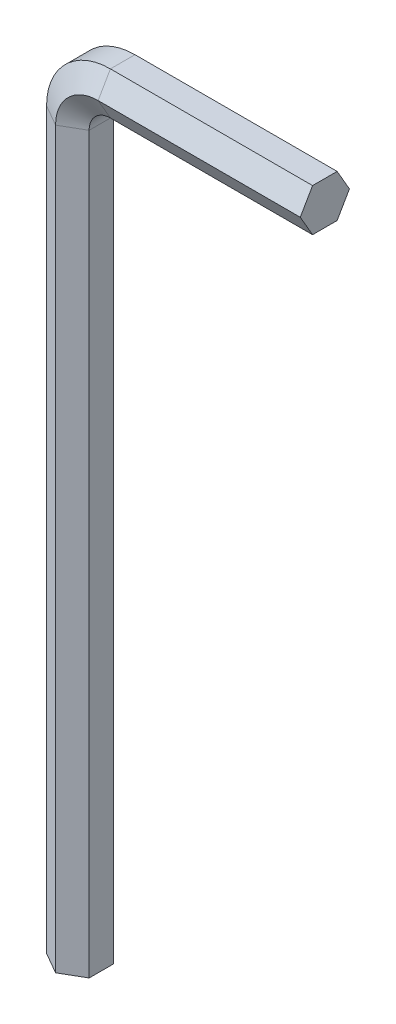
ISO-10303-21;
HEADER;
FILE_DESCRIPTION(('STEP AP214'),'2;1');
FILE_NAME('part.step','',(''),(''),'','','');
FILE_SCHEMA(('AUTOMOTIVE_DESIGN { 1 0 10303 214 1 1 1 1 }'));
ENDSEC;
DATA;
#1=APPLICATION_CONTEXT('core data for automotive mechanical design processes');
#2=APPLICATION_PROTOCOL_DEFINITION('international standard','automotive_design',2000,#1);
#3=PRODUCT_CONTEXT('',#1,'mechanical');
#4=PRODUCT('Part','Part','',(#3));
#5=PRODUCT_RELATED_PRODUCT_CATEGORY('part','',(#4));
#6=PRODUCT_DEFINITION_FORMATION('','',#4);
#7=PRODUCT_DEFINITION_CONTEXT('part definition',#1,'design');
#8=PRODUCT_DEFINITION('design','',#6,#7);
#9=PRODUCT_DEFINITION_SHAPE('','',#8);
#10=(LENGTH_UNIT() NAMED_UNIT(*) SI_UNIT(.MILLI.,.METRE.));
#11=(NAMED_UNIT(*) PLANE_ANGLE_UNIT() SI_UNIT($,.RADIAN.));
#12=(NAMED_UNIT(*) SI_UNIT($,.STERADIAN.) SOLID_ANGLE_UNIT());
#13=UNCERTAINTY_MEASURE_WITH_UNIT(LENGTH_MEASURE(1.E-05),#10,'distance_accuracy_value','');
#14=(GEOMETRIC_REPRESENTATION_CONTEXT(3) GLOBAL_UNCERTAINTY_ASSIGNED_CONTEXT((#13)) GLOBAL_UNIT_ASSIGNED_CONTEXT((#10,
#11,#12)) REPRESENTATION_CONTEXT('',''));
#15=CARTESIAN_POINT('',(0.,0.,0.));
#16=DIRECTION('',(0.,0.,1.));
#17=DIRECTION('',(1.,0.,0.));
#18=AXIS2_PLACEMENT_3D('',#15,#16,#17);
#19=CARTESIAN_POINT('',(0.,0.,0.));
#20=DIRECTION('',(0.,1.,0.));
#21=DIRECTION('',(0.,0.,1.));
#22=AXIS2_PLACEMENT_3D('',#19,#20,#21);
#23=PLANE('',#22);
#24=DIRECTION('',(0.866025403784438,0.,-0.500000000000001));
#25=VECTOR('',#24,1.);
#26=CARTESIAN_POINT('',(2.,0.,2.30940107675851));
#27=LINE('',#26,#25);
#28=CARTESIAN_POINT('',(2.,0.,2.30940107675851));
#29=VERTEX_POINT('',#28);
#30=CARTESIAN_POINT('',(4.,0.,1.15470053837925));
#31=VERTEX_POINT('',#30);
#32=EDGE_CURVE('E183',#29,#31,#27,.T.);
#33=ORIENTED_EDGE('',*,*,#32,.F.);
#34=DIRECTION('',(0.866025403784439,0.,0.5));
#35=VECTOR('',#34,1.);
#36=CARTESIAN_POINT('',(0.,0.,1.15470053837926));
#37=LINE('',#36,#35);
#38=CARTESIAN_POINT('',(0.,0.,1.15470053837926));
#39=VERTEX_POINT('',#38);
#40=EDGE_CURVE('E225',#39,#29,#37,.T.);
#41=ORIENTED_EDGE('',*,*,#40,.F.);
#42=DIRECTION('',(0.,0.,1.));
#43=VECTOR('',#42,1.);
#44=CARTESIAN_POINT('',(0.,0.,-1.15470053837926));
#45=LINE('',#44,#43);
#46=CARTESIAN_POINT('',(0.,0.,-1.15470053837926));
#47=VERTEX_POINT('',#46);
#48=EDGE_CURVE('E212',#47,#39,#45,.T.);
#49=ORIENTED_EDGE('',*,*,#48,.F.);
#50=DIRECTION('',(-0.866025403784438,0.,0.5));
#51=VECTOR('',#50,1.);
#52=CARTESIAN_POINT('',(2.,0.,-2.30940107675851));
#53=LINE('',#52,#51);
#54=CARTESIAN_POINT('',(2.,0.,-2.30940107675851));
#55=VERTEX_POINT('',#54);
#56=EDGE_CURVE('E135',#55,#47,#53,.T.);
#57=ORIENTED_EDGE('',*,*,#56,.F.);
#58=DIRECTION('',(-0.866025403784437,0.,-0.500000000000003));
#59=VECTOR('',#58,1.);
#60=CARTESIAN_POINT('',(4.,0.,-1.15470053837925));
#61=LINE('',#60,#59);
#62=CARTESIAN_POINT('',(4.,0.,-1.15470053837925));
#63=VERTEX_POINT('',#62);
#64=EDGE_CURVE('E139',#63,#55,#61,.T.);
#65=ORIENTED_EDGE('',*,*,#64,.F.);
#66=DIRECTION('',(0.,0.,-1.));
#67=VECTOR('',#66,1.);
#68=CARTESIAN_POINT('',(4.,0.,1.15470053837925));
#69=LINE('',#68,#67);
#70=EDGE_CURVE('E144',#31,#63,#69,.T.);
#71=ORIENTED_EDGE('',*,*,#70,.F.);
#72=EDGE_LOOP('',(#33,#41,#49,#57,#65,#71));
#73=FACE_BOUND('',#72,.T.);
#74=ADVANCED_FACE('F34',(#73),#23,.F.);
#75=CARTESIAN_POINT('',(25.,75.,0.));
#76=DIRECTION('',(1.,0.,0.));
#77=DIRECTION('',(0.,0.,1.));
#78=AXIS2_PLACEMENT_3D('',#75,#76,#77);
#79=PLANE('',#78);
#80=DIRECTION('',(0.,-0.866025403784438,-0.500000000000001));
#81=VECTOR('',#80,1.);
#82=CARTESIAN_POINT('',(25.,73.,2.30940107675851));
#83=LINE('',#82,#81);
#84=CARTESIAN_POINT('',(25.,73.,2.30940107675851));
#85=VERTEX_POINT('',#84);
#86=CARTESIAN_POINT('',(25.,71.,1.15470053837925));
#87=VERTEX_POINT('',#86);
#88=EDGE_CURVE('E155',#85,#87,#83,.T.);
#89=ORIENTED_EDGE('',*,*,#88,.T.);
#90=DIRECTION('',(0.,0.,-1.));
#91=VECTOR('',#90,1.);
#92=CARTESIAN_POINT('',(25.,71.,1.15470053837925));
#93=LINE('',#92,#91);
#94=CARTESIAN_POINT('',(25.,71.,-1.15470053837925));
#95=VERTEX_POINT('',#94);
#96=EDGE_CURVE('E158',#87,#95,#93,.T.);
#97=ORIENTED_EDGE('',*,*,#96,.T.);
#98=DIRECTION('',(0.,0.866025403784437,-0.500000000000003));
#99=VECTOR('',#98,1.);
#100=CARTESIAN_POINT('',(25.,71.,-1.15470053837925));
#101=LINE('',#100,#99);
#102=CARTESIAN_POINT('',(25.,73.,-2.30940107675851));
#103=VERTEX_POINT('',#102);
#104=EDGE_CURVE('E198',#95,#103,#101,.T.);
#105=ORIENTED_EDGE('',*,*,#104,.T.);
#106=DIRECTION('',(0.,0.866025403784438,0.5));
#107=VECTOR('',#106,1.);
#108=CARTESIAN_POINT('',(25.,73.,-2.30940107675851));
#109=LINE('',#108,#107);
#110=CARTESIAN_POINT('',(25.,75.,-1.15470053837926));
#111=VERTEX_POINT('',#110);
#112=EDGE_CURVE('E53',#103,#111,#109,.T.);
#113=ORIENTED_EDGE('',*,*,#112,.T.);
#114=DIRECTION('',(0.,0.,1.));
#115=VECTOR('',#114,1.);
#116=CARTESIAN_POINT('',(25.,75.,-1.15470053837926));
#117=LINE('',#116,#115);
#118=CARTESIAN_POINT('',(25.,75.,1.15470053837926));
#119=VERTEX_POINT('',#118);
#120=EDGE_CURVE('E47',#111,#119,#117,.T.);
#121=ORIENTED_EDGE('',*,*,#120,.T.);
#122=DIRECTION('',(0.,-0.866025403784439,0.5));
#123=VECTOR('',#122,1.);
#124=CARTESIAN_POINT('',(25.,75.,1.15470053837926));
#125=LINE('',#124,#123);
#126=EDGE_CURVE('E11',#119,#85,#125,.T.);
#127=ORIENTED_EDGE('',*,*,#126,.T.);
#128=EDGE_LOOP('',(#89,#97,#105,#113,#121,#127));
#129=FACE_BOUND('',#128,.T.);
#130=ADVANCED_FACE('F157',(#129),#79,.T.);
#131=CARTESIAN_POINT('',(2.,0.,2.30940107675851));
#132=DIRECTION('',(0.500000000000001,0.,0.866025403784438));
#133=DIRECTION('',(0.866025403784438,0.,-0.500000000000001));
#134=AXIS2_PLACEMENT_3D('',#131,#132,#133);
#135=PLANE('',#134);
#136=DIRECTION('',(0.,1.,0.));
#137=VECTOR('',#136,1.);
#138=CARTESIAN_POINT('',(4.,0.,1.15470053837925));
#139=LINE('',#138,#137);
#140=CARTESIAN_POINT('',(4.,69.,1.15470053837925));
#141=VERTEX_POINT('',#140);
#142=EDGE_CURVE('E188',#31,#141,#139,.T.);
#143=ORIENTED_EDGE('',*,*,#142,.T.);
#144=DIRECTION('',(0.866025403784438,0.,-0.500000000000001));
#145=VECTOR('',#144,1.);
#146=CARTESIAN_POINT('',(2.,69.,2.30940107675851));
#147=LINE('',#146,#145);
#148=CARTESIAN_POINT('',(2.,69.,2.30940107675851));
#149=VERTEX_POINT('',#148);
#150=EDGE_CURVE('E257',#149,#141,#147,.T.);
#151=ORIENTED_EDGE('',*,*,#150,.F.);
#152=DIRECTION('',(0.,1.,0.));
#153=VECTOR('',#152,1.);
#154=CARTESIAN_POINT('',(2.,0.,2.30940107675851));
#155=LINE('',#154,#153);
#156=EDGE_CURVE('E239',#29,#149,#155,.T.);
#157=ORIENTED_EDGE('',*,*,#156,.F.);
#158=ORIENTED_EDGE('',*,*,#32,.T.);
#159=EDGE_LOOP('',(#143,#151,#157,#158));
#160=FACE_BOUND('',#159,.T.);
#161=ADVANCED_FACE('F264',(#160),#135,.T.);
#162=CARTESIAN_POINT('',(4.,0.,1.15470053837925));
#163=DIRECTION('',(1.,0.,0.));
#164=DIRECTION('',(0.,0.,-1.));
#165=AXIS2_PLACEMENT_3D('',#162,#163,#164);
#166=PLANE('',#165);
#167=DIRECTION('',(0.,1.,0.));
#168=VECTOR('',#167,1.);
#169=CARTESIAN_POINT('',(4.,0.,-1.15470053837925));
#170=LINE('',#169,#168);
#171=CARTESIAN_POINT('',(4.,69.,-1.15470053837925));
#172=VERTEX_POINT('',#171);
#173=EDGE_CURVE('E187',#63,#172,#170,.T.);
#174=ORIENTED_EDGE('',*,*,#173,.T.);
#175=DIRECTION('',(0.,0.,-1.));
#176=VECTOR('',#175,1.);
#177=CARTESIAN_POINT('',(4.,69.,1.15470053837925));
#178=LINE('',#177,#176);
#179=EDGE_CURVE('E184',#141,#172,#178,.T.);
#180=ORIENTED_EDGE('',*,*,#179,.F.);
#181=ORIENTED_EDGE('',*,*,#142,.F.);
#182=ORIENTED_EDGE('',*,*,#70,.T.);
#183=EDGE_LOOP('',(#174,#180,#181,#182));
#184=FACE_BOUND('',#183,.T.);
#185=ADVANCED_FACE('F267',(#184),#166,.T.);
#186=CARTESIAN_POINT('',(4.,0.,-1.15470053837925));
#187=DIRECTION('',(0.500000000000003,0.,-0.866025403784437));
#188=DIRECTION('',(-0.866025403784437,0.,-0.500000000000003));
#189=AXIS2_PLACEMENT_3D('',#186,#187,#188);
#190=PLANE('',#189);
#191=DIRECTION('',(0.,1.,0.));
#192=VECTOR('',#191,1.);
#193=CARTESIAN_POINT('',(2.,0.,-2.30940107675851));
#194=LINE('',#193,#192);
#195=CARTESIAN_POINT('',(2.,69.,-2.30940107675851));
#196=VERTEX_POINT('',#195);
#197=EDGE_CURVE('E201',#55,#196,#194,.T.);
#198=ORIENTED_EDGE('',*,*,#197,.T.);
#199=DIRECTION('',(-0.866025403784437,0.,-0.500000000000003));
#200=VECTOR('',#199,1.);
#201=CARTESIAN_POINT('',(4.,69.,-1.15470053837925));
#202=LINE('',#201,#200);
#203=EDGE_CURVE('E191',#172,#196,#202,.T.);
#204=ORIENTED_EDGE('',*,*,#203,.F.);
#205=ORIENTED_EDGE('',*,*,#173,.F.);
#206=ORIENTED_EDGE('',*,*,#64,.T.);
#207=EDGE_LOOP('',(#198,#204,#205,#206));
#208=FACE_BOUND('',#207,.T.);
#209=ADVANCED_FACE('F321',(#208),#190,.T.);
#210=CARTESIAN_POINT('',(2.,0.,-2.30940107675851));
#211=DIRECTION('',(-0.5,0.,-0.866025403784439));
#212=DIRECTION('',(-0.866025403784439,0.,0.5));
#213=AXIS2_PLACEMENT_3D('',#210,#211,#212);
#214=PLANE('',#213);
#215=DIRECTION('',(0.,1.,0.));
#216=VECTOR('',#215,1.);
#217=CARTESIAN_POINT('',(0.,0.,-1.15470053837926));
#218=LINE('',#217,#216);
#219=CARTESIAN_POINT('',(0.,69.,-1.15470053837926));
#220=VERTEX_POINT('',#219);
#221=EDGE_CURVE('E214',#47,#220,#218,.T.);
#222=ORIENTED_EDGE('',*,*,#221,.T.);
#223=DIRECTION('',(-0.866025403784438,0.,0.5));
#224=VECTOR('',#223,1.);
#225=CARTESIAN_POINT('',(2.,69.,-2.30940107675851));
#226=LINE('',#225,#224);
#227=EDGE_CURVE('E204',#196,#220,#226,.T.);
#228=ORIENTED_EDGE('',*,*,#227,.F.);
#229=ORIENTED_EDGE('',*,*,#197,.F.);
#230=ORIENTED_EDGE('',*,*,#56,.T.);
#231=EDGE_LOOP('',(#222,#228,#229,#230));
#232=FACE_BOUND('',#231,.T.);
#233=ADVANCED_FACE('F329',(#232),#214,.T.);
#234=CARTESIAN_POINT('',(0.,0.,-1.15470053837926));
#235=DIRECTION('',(-1.,0.,0.));
#236=DIRECTION('',(0.,0.,1.));
#237=AXIS2_PLACEMENT_3D('',#234,#235,#236);
#238=PLANE('',#237);
#239=DIRECTION('',(0.,1.,0.));
#240=VECTOR('',#239,1.);
#241=CARTESIAN_POINT('',(0.,0.,1.15470053837926));
#242=LINE('',#241,#240);
#243=CARTESIAN_POINT('',(0.,69.,1.15470053837926));
#244=VERTEX_POINT('',#243);
#245=EDGE_CURVE('E227',#39,#244,#242,.T.);
#246=ORIENTED_EDGE('',*,*,#245,.T.);
#247=DIRECTION('',(0.,0.,1.));
#248=VECTOR('',#247,1.);
#249=CARTESIAN_POINT('',(0.,69.,-1.15470053837926));
#250=LINE('',#249,#248);
#251=EDGE_CURVE('E217',#220,#244,#250,.T.);
#252=ORIENTED_EDGE('',*,*,#251,.F.);
#253=ORIENTED_EDGE('',*,*,#221,.F.);
#254=ORIENTED_EDGE('',*,*,#48,.T.);
#255=EDGE_LOOP('',(#246,#252,#253,#254));
#256=FACE_BOUND('',#255,.T.);
#257=ADVANCED_FACE('F339',(#256),#238,.T.);
#258=CARTESIAN_POINT('',(0.,0.,1.15470053837926));
#259=DIRECTION('',(-0.5,0.,0.866025403784439));
#260=DIRECTION('',(0.866025403784439,0.,0.5));
#261=AXIS2_PLACEMENT_3D('',#258,#259,#260);
#262=PLANE('',#261);
#263=DIRECTION('',(0.866025403784439,0.,0.5));
#264=VECTOR('',#263,1.);
#265=CARTESIAN_POINT('',(0.,69.,1.15470053837926));
#266=LINE('',#265,#264);
#267=EDGE_CURVE('E230',#244,#149,#266,.T.);
#268=ORIENTED_EDGE('',*,*,#267,.F.);
#269=ORIENTED_EDGE('',*,*,#245,.F.);
#270=ORIENTED_EDGE('',*,*,#40,.T.);
#271=ORIENTED_EDGE('',*,*,#156,.T.);
#272=EDGE_LOOP('',(#268,#269,#270,#271));
#273=FACE_BOUND('',#272,.T.);
#274=ADVANCED_FACE('F280',(#273),#262,.T.);
#275=CARTESIAN_POINT('',(6.,69.,2.30940107675851));
#276=DIRECTION('',(0.,0.,1.));
#277=DIRECTION('',(1.,0.,0.));
#278=AXIS2_PLACEMENT_3D('',#275,#276,#277);
#279=CONICAL_SURFACE('',#278,4.,1.0471975511966);
#280=CARTESIAN_POINT('',(6.,69.,1.15470053837925));
#281=DIRECTION('',(0.,0.,-1.));
#282=DIRECTION('',(-1.,0.,0.));
#283=AXIS2_PLACEMENT_3D('',#280,#281,#282);
#284=CIRCLE('',#283,2.);
#285=CARTESIAN_POINT('',(6.,71.,1.15470053837925));
#286=VERTEX_POINT('',#285);
#287=EDGE_CURVE('E194',#141,#286,#284,.T.);
#288=ORIENTED_EDGE('',*,*,#287,.T.);
#289=DIRECTION('',(0.,-0.866025403784438,-0.500000000000001));
#290=VECTOR('',#289,1.);
#291=CARTESIAN_POINT('',(6.,73.,2.30940107675851));
#292=LINE('',#291,#290);
#293=CARTESIAN_POINT('',(6.,73.,2.30940107675851));
#294=VERTEX_POINT('',#293);
#295=EDGE_CURVE('E176',#294,#286,#292,.T.);
#296=ORIENTED_EDGE('',*,*,#295,.F.);
#297=CARTESIAN_POINT('',(6.,69.,2.30940107675851));
#298=DIRECTION('',(0.,0.,-1.));
#299=DIRECTION('',(-1.,0.,0.));
#300=AXIS2_PLACEMENT_3D('',#297,#298,#299);
#301=CIRCLE('',#300,4.);
#302=EDGE_CURVE('E241',#149,#294,#301,.T.);
#303=ORIENTED_EDGE('',*,*,#302,.F.);
#304=ORIENTED_EDGE('',*,*,#150,.T.);
#305=EDGE_LOOP('',(#288,#296,#303,#304));
#306=FACE_BOUND('',#305,.T.);
#307=ADVANCED_FACE('F247',(#306),#279,.F.);
#308=CARTESIAN_POINT('',(6.,69.,0.));
#309=DIRECTION('',(0.,0.,-1.));
#310=DIRECTION('',(-1.,0.,0.));
#311=AXIS2_PLACEMENT_3D('',#308,#309,#310);
#312=CYLINDRICAL_SURFACE('',#311,2.);
#313=CARTESIAN_POINT('',(6.,69.,-1.15470053837925));
#314=DIRECTION('',(0.,0.,-1.));
#315=DIRECTION('',(-1.,0.,0.));
#316=AXIS2_PLACEMENT_3D('',#313,#314,#315);
#317=CIRCLE('',#316,2.);
#318=CARTESIAN_POINT('',(6.,71.,-1.15470053837925));
#319=VERTEX_POINT('',#318);
#320=EDGE_CURVE('E122',#172,#319,#317,.T.);
#321=ORIENTED_EDGE('',*,*,#320,.T.);
#322=DIRECTION('',(0.,0.,-1.));
#323=VECTOR('',#322,1.);
#324=CARTESIAN_POINT('',(6.,71.,1.15470053837925));
#325=LINE('',#324,#323);
#326=EDGE_CURVE('E192',#286,#319,#325,.T.);
#327=ORIENTED_EDGE('',*,*,#326,.F.);
#328=ORIENTED_EDGE('',*,*,#287,.F.);
#329=ORIENTED_EDGE('',*,*,#179,.T.);
#330=EDGE_LOOP('',(#321,#327,#328,#329));
#331=FACE_BOUND('',#330,.T.);
#332=ADVANCED_FACE('F270',(#331),#312,.F.);
#333=CARTESIAN_POINT('',(6.,69.,-1.15470053837925));
#334=DIRECTION('',(0.,0.,-1.));
#335=DIRECTION('',(-1.,0.,0.));
#336=AXIS2_PLACEMENT_3D('',#333,#334,#335);
#337=CONICAL_SURFACE('',#336,2.,1.04719755119659);
#338=CARTESIAN_POINT('',(6.,69.,-2.30940107675851));
#339=DIRECTION('',(0.,0.,-1.));
#340=DIRECTION('',(-1.,0.,0.));
#341=AXIS2_PLACEMENT_3D('',#338,#339,#340);
#342=CIRCLE('',#341,4.);
#343=CARTESIAN_POINT('',(6.,73.,-2.30940107675851));
#344=VERTEX_POINT('',#343);
#345=EDGE_CURVE('E113',#196,#344,#342,.T.);
#346=ORIENTED_EDGE('',*,*,#345,.T.);
#347=DIRECTION('',(0.,0.866025403784437,-0.500000000000003));
#348=VECTOR('',#347,1.);
#349=CARTESIAN_POINT('',(6.,71.,-1.15470053837925));
#350=LINE('',#349,#348);
#351=EDGE_CURVE('E195',#319,#344,#350,.T.);
#352=ORIENTED_EDGE('',*,*,#351,.F.);
#353=ORIENTED_EDGE('',*,*,#320,.F.);
#354=ORIENTED_EDGE('',*,*,#203,.T.);
#355=EDGE_LOOP('',(#346,#352,#353,#354));
#356=FACE_BOUND('',#355,.T.);
#357=ADVANCED_FACE('F272',(#356),#337,.F.);
#358=CARTESIAN_POINT('',(6.,69.,-2.30940107675851));
#359=DIRECTION('',(0.,0.,1.));
#360=DIRECTION('',(1.,0.,0.));
#361=AXIS2_PLACEMENT_3D('',#358,#359,#360);
#362=CONICAL_SURFACE('',#361,4.,1.0471975511966);
#363=CARTESIAN_POINT('',(6.,69.,-1.15470053837926));
#364=DIRECTION('',(0.,0.,-1.));
#365=DIRECTION('',(-1.,0.,0.));
#366=AXIS2_PLACEMENT_3D('',#363,#364,#365);
#367=CIRCLE('',#366,6.);
#368=CARTESIAN_POINT('',(6.,75.,-1.15470053837926));
#369=VERTEX_POINT('',#368);
#370=EDGE_CURVE('E106',#220,#369,#367,.T.);
#371=ORIENTED_EDGE('',*,*,#370,.T.);
#372=DIRECTION('',(0.,0.866025403784438,0.5));
#373=VECTOR('',#372,1.);
#374=CARTESIAN_POINT('',(6.,73.,-2.30940107675851));
#375=LINE('',#374,#373);
#376=EDGE_CURVE('E208',#344,#369,#375,.T.);
#377=ORIENTED_EDGE('',*,*,#376,.F.);
#378=ORIENTED_EDGE('',*,*,#345,.F.);
#379=ORIENTED_EDGE('',*,*,#227,.T.);
#380=EDGE_LOOP('',(#371,#377,#378,#379));
#381=FACE_BOUND('',#380,.T.);
#382=ADVANCED_FACE('F278',(#381),#362,.T.);
#383=CARTESIAN_POINT('',(6.,69.,0.));
#384=DIRECTION('',(0.,0.,-1.));
#385=DIRECTION('',(-1.,0.,0.));
#386=AXIS2_PLACEMENT_3D('',#383,#384,#385);
#387=CYLINDRICAL_SURFACE('',#386,6.);
#388=CARTESIAN_POINT('',(6.,69.,1.15470053837926));
#389=DIRECTION('',(0.,0.,-1.));
#390=DIRECTION('',(-1.,0.,0.));
#391=AXIS2_PLACEMENT_3D('',#388,#389,#390);
#392=CIRCLE('',#391,6.);
#393=CARTESIAN_POINT('',(6.,75.,1.15470053837926));
#394=VERTEX_POINT('',#393);
#395=EDGE_CURVE('E232',#244,#394,#392,.T.);
#396=ORIENTED_EDGE('',*,*,#395,.T.);
#397=DIRECTION('',(0.,0.,1.));
#398=VECTOR('',#397,1.);
#399=CARTESIAN_POINT('',(6.,75.,-1.15470053837926));
#400=LINE('',#399,#398);
#401=EDGE_CURVE('E220',#369,#394,#400,.T.);
#402=ORIENTED_EDGE('',*,*,#401,.F.);
#403=ORIENTED_EDGE('',*,*,#370,.F.);
#404=ORIENTED_EDGE('',*,*,#251,.T.);
#405=EDGE_LOOP('',(#396,#402,#403,#404));
#406=FACE_BOUND('',#405,.T.);
#407=ADVANCED_FACE('F382',(#406),#387,.T.);
#408=CARTESIAN_POINT('',(6.,69.,1.15470053837926));
#409=DIRECTION('',(0.,0.,-1.));
#410=DIRECTION('',(-1.,0.,0.));
#411=AXIS2_PLACEMENT_3D('',#408,#409,#410);
#412=CONICAL_SURFACE('',#411,6.,1.0471975511966);
#413=DIRECTION('',(0.,-0.866025403784439,0.5));
#414=VECTOR('',#413,1.);
#415=CARTESIAN_POINT('',(6.,75.,1.15470053837926));
#416=LINE('',#415,#414);
#417=EDGE_CURVE('E181',#394,#294,#416,.T.);
#418=ORIENTED_EDGE('',*,*,#417,.F.);
#419=ORIENTED_EDGE('',*,*,#395,.F.);
#420=ORIENTED_EDGE('',*,*,#267,.T.);
#421=ORIENTED_EDGE('',*,*,#302,.T.);
#422=EDGE_LOOP('',(#418,#419,#420,#421));
#423=FACE_BOUND('',#422,.T.);
#424=ADVANCED_FACE('F250',(#423),#412,.T.);
#425=CARTESIAN_POINT('',(6.,73.,2.30940107675851));
#426=DIRECTION('',(0.,-0.500000000000001,0.866025403784438));
#427=DIRECTION('',(0.,-0.866025403784438,-0.500000000000001));
#428=AXIS2_PLACEMENT_3D('',#425,#426,#427);
#429=PLANE('',#428);
#430=DIRECTION('',(1.,0.,0.));
#431=VECTOR('',#430,1.);
#432=CARTESIAN_POINT('',(6.,71.,1.15470053837925));
#433=LINE('',#432,#431);
#434=EDGE_CURVE('E163',#286,#87,#433,.T.);
#435=ORIENTED_EDGE('',*,*,#434,.T.);
#436=ORIENTED_EDGE('',*,*,#88,.F.);
#437=DIRECTION('',(1.,0.,0.));
#438=VECTOR('',#437,1.);
#439=CARTESIAN_POINT('',(6.,73.,2.30940107675851));
#440=LINE('',#439,#438);
#441=EDGE_CURVE('E164',#294,#85,#440,.T.);
#442=ORIENTED_EDGE('',*,*,#441,.F.);
#443=ORIENTED_EDGE('',*,*,#295,.T.);
#444=EDGE_LOOP('',(#435,#436,#442,#443));
#445=FACE_BOUND('',#444,.T.);
#446=ADVANCED_FACE('F174',(#445),#429,.T.);
#447=CARTESIAN_POINT('',(6.,71.,1.15470053837925));
#448=DIRECTION('',(0.,-1.,0.));
#449=DIRECTION('',(0.,0.,-1.));
#450=AXIS2_PLACEMENT_3D('',#447,#448,#449);
#451=PLANE('',#450);
#452=DIRECTION('',(1.,0.,0.));
#453=VECTOR('',#452,1.);
#454=CARTESIAN_POINT('',(6.,71.,-1.15470053837925));
#455=LINE('',#454,#453);
#456=EDGE_CURVE('E171',#319,#95,#455,.T.);
#457=ORIENTED_EDGE('',*,*,#456,.T.);
#458=ORIENTED_EDGE('',*,*,#96,.F.);
#459=ORIENTED_EDGE('',*,*,#434,.F.);
#460=ORIENTED_EDGE('',*,*,#326,.T.);
#461=EDGE_LOOP('',(#457,#458,#459,#460));
#462=FACE_BOUND('',#461,.T.);
#463=ADVANCED_FACE('F168',(#462),#451,.T.);
#464=CARTESIAN_POINT('',(6.,71.,-1.15470053837925));
#465=DIRECTION('',(0.,-0.500000000000003,-0.866025403784437));
#466=DIRECTION('',(0.,0.866025403784437,-0.500000000000003));
#467=AXIS2_PLACEMENT_3D('',#464,#465,#466);
#468=PLANE('',#467);
#469=DIRECTION('',(1.,0.,0.));
#470=VECTOR('',#469,1.);
#471=CARTESIAN_POINT('',(6.,73.,-2.30940107675851));
#472=LINE('',#471,#470);
#473=EDGE_CURVE('E91',#344,#103,#472,.T.);
#474=ORIENTED_EDGE('',*,*,#473,.T.);
#475=ORIENTED_EDGE('',*,*,#104,.F.);
#476=ORIENTED_EDGE('',*,*,#456,.F.);
#477=ORIENTED_EDGE('',*,*,#351,.T.);
#478=EDGE_LOOP('',(#474,#475,#476,#477));
#479=FACE_BOUND('',#478,.T.);
#480=ADVANCED_FACE('F414',(#479),#468,.T.);
#481=CARTESIAN_POINT('',(6.,73.,-2.30940107675851));
#482=DIRECTION('',(0.,0.5,-0.866025403784439));
#483=DIRECTION('',(0.,0.866025403784438,0.5));
#484=AXIS2_PLACEMENT_3D('',#481,#482,#483);
#485=PLANE('',#484);
#486=DIRECTION('',(1.,0.,0.));
#487=VECTOR('',#486,1.);
#488=CARTESIAN_POINT('',(6.,75.,-1.15470053837926));
#489=LINE('',#488,#487);
#490=EDGE_CURVE('E83',#369,#111,#489,.T.);
#491=ORIENTED_EDGE('',*,*,#490,.T.);
#492=ORIENTED_EDGE('',*,*,#112,.F.);
#493=ORIENTED_EDGE('',*,*,#473,.F.);
#494=ORIENTED_EDGE('',*,*,#376,.T.);
#495=EDGE_LOOP('',(#491,#492,#493,#494));
#496=FACE_BOUND('',#495,.T.);
#497=ADVANCED_FACE('F290',(#496),#485,.T.);
#498=CARTESIAN_POINT('',(6.,75.,-1.15470053837926));
#499=DIRECTION('',(0.,1.,0.));
#500=DIRECTION('',(0.,0.,1.));
#501=AXIS2_PLACEMENT_3D('',#498,#499,#500);
#502=PLANE('',#501);
#503=DIRECTION('',(1.,0.,0.));
#504=VECTOR('',#503,1.);
#505=CARTESIAN_POINT('',(6.,75.,1.15470053837926));
#506=LINE('',#505,#504);
#507=EDGE_CURVE('E41',#394,#119,#506,.T.);
#508=ORIENTED_EDGE('',*,*,#507,.T.);
#509=ORIENTED_EDGE('',*,*,#120,.F.);
#510=ORIENTED_EDGE('',*,*,#490,.F.);
#511=ORIENTED_EDGE('',*,*,#401,.T.);
#512=EDGE_LOOP('',(#508,#509,#510,#511));
#513=FACE_BOUND('',#512,.T.);
#514=ADVANCED_FACE('F285',(#513),#502,.T.);
#515=CARTESIAN_POINT('',(6.,75.,1.15470053837926));
#516=DIRECTION('',(0.,0.5,0.866025403784439));
#517=DIRECTION('',(0.,-0.866025403784439,0.5));
#518=AXIS2_PLACEMENT_3D('',#515,#516,#517);
#519=PLANE('',#518);
#520=ORIENTED_EDGE('',*,*,#126,.F.);
#521=ORIENTED_EDGE('',*,*,#507,.F.);
#522=ORIENTED_EDGE('',*,*,#417,.T.);
#523=ORIENTED_EDGE('',*,*,#441,.T.);
#524=EDGE_LOOP('',(#520,#521,#522,#523));
#525=FACE_BOUND('',#524,.T.);
#526=ADVANCED_FACE('F242',(#525),#519,.T.);
#527=CLOSED_SHELL('',(#74,#130,#161,#185,#209,#233,#257,#274,#307,#332,#357,#382,#407,#424,#446,
#463,#480,#497,#514,#526));
#528=MANIFOLD_SOLID_BREP('B2',#527);
#529=ADVANCED_BREP_SHAPE_REPRESENTATION('',(#18,#528),#14);
#530=SHAPE_DEFINITION_REPRESENTATION(#9,#529);
ENDSEC;
END-ISO-10303-21;
